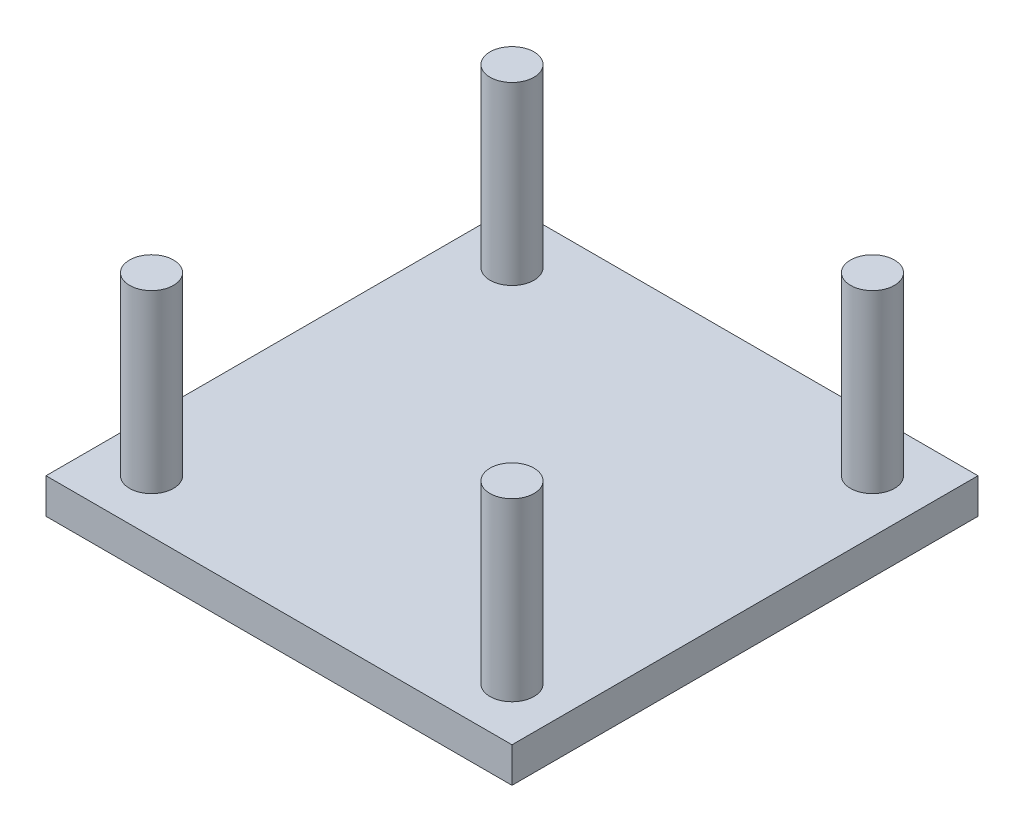
ISO-10303-21;
HEADER;
FILE_DESCRIPTION(('STEP AP214'),'2;1');
FILE_NAME('part.step','',(''),(''),'','','');
FILE_SCHEMA(('AUTOMOTIVE_DESIGN { 1 0 10303 214 1 1 1 1 }'));
ENDSEC;
DATA;
#1=APPLICATION_CONTEXT('core data for automotive mechanical design processes');
#2=APPLICATION_PROTOCOL_DEFINITION('international standard','automotive_design',2000,#1);
#3=PRODUCT_CONTEXT('',#1,'mechanical');
#4=PRODUCT('Part','Part','',(#3));
#5=PRODUCT_RELATED_PRODUCT_CATEGORY('part','',(#4));
#6=PRODUCT_DEFINITION_FORMATION('','',#4);
#7=PRODUCT_DEFINITION_CONTEXT('part definition',#1,'design');
#8=PRODUCT_DEFINITION('design','',#6,#7);
#9=PRODUCT_DEFINITION_SHAPE('','',#8);
#10=(LENGTH_UNIT() NAMED_UNIT(*) SI_UNIT(.MILLI.,.METRE.));
#11=(NAMED_UNIT(*) PLANE_ANGLE_UNIT() SI_UNIT($,.RADIAN.));
#12=(NAMED_UNIT(*) SI_UNIT($,.STERADIAN.) SOLID_ANGLE_UNIT());
#13=UNCERTAINTY_MEASURE_WITH_UNIT(LENGTH_MEASURE(1.E-05),#10,'distance_accuracy_value','');
#14=(GEOMETRIC_REPRESENTATION_CONTEXT(3) GLOBAL_UNCERTAINTY_ASSIGNED_CONTEXT((#13)) GLOBAL_UNIT_ASSIGNED_CONTEXT((#10,
#11,#12)) REPRESENTATION_CONTEXT('',''));
#15=CARTESIAN_POINT('',(0.,0.,0.));
#16=DIRECTION('',(0.,0.,1.));
#17=DIRECTION('',(1.,0.,0.));
#18=AXIS2_PLACEMENT_3D('',#15,#16,#17);
#19=CARTESIAN_POINT('',(-10.25,10.,10.25));
#20=DIRECTION('',(0.,-1.,0.));
#21=DIRECTION('',(0.,0.,-1.));
#22=AXIS2_PLACEMENT_3D('',#19,#20,#21);
#23=CYLINDRICAL_SURFACE('',#22,1.25);
#24=CARTESIAN_POINT('',(-10.25,10.,10.25));
#25=DIRECTION('',(0.,1.,0.));
#26=DIRECTION('',(0.,0.,1.));
#27=AXIS2_PLACEMENT_3D('',#24,#25,#26);
#28=CIRCLE('',#27,1.25);
#29=CARTESIAN_POINT('',(-10.25,10.,11.5));
#30=VERTEX_POINT('',#29);
#31=EDGE_CURVE('E111',#30,#30,#28,.T.);
#32=ORIENTED_EDGE('',*,*,#31,.F.);
#33=EDGE_LOOP('',(#32));
#34=FACE_BOUND('',#33,.T.);
#35=CARTESIAN_POINT('',(-10.25,0.,10.25));
#36=DIRECTION('',(0.,1.,0.));
#37=DIRECTION('',(0.,0.,1.));
#38=AXIS2_PLACEMENT_3D('',#35,#36,#37);
#39=CIRCLE('',#38,1.25);
#40=CARTESIAN_POINT('',(-10.25,0.,11.5));
#41=VERTEX_POINT('',#40);
#42=EDGE_CURVE('E110',#41,#41,#39,.T.);
#43=ORIENTED_EDGE('',*,*,#42,.T.);
#44=EDGE_LOOP('',(#43));
#45=FACE_BOUND('',#44,.T.);
#46=ADVANCED_FACE('F33',(#34,#45),#23,.T.);
#47=CARTESIAN_POINT('',(-10.25,10.,10.25));
#48=DIRECTION('',(0.,1.,0.));
#49=DIRECTION('',(0.,0.,1.));
#50=AXIS2_PLACEMENT_3D('',#47,#48,#49);
#51=PLANE('',#50);
#52=ORIENTED_EDGE('',*,*,#31,.T.);
#53=EDGE_LOOP('',(#52));
#54=FACE_BOUND('',#53,.T.);
#55=ADVANCED_FACE('F147',(#54),#51,.T.);
#56=CARTESIAN_POINT('',(13.25,-2.,13.25));
#57=DIRECTION('',(-1.,0.,0.));
#58=DIRECTION('',(0.,0.,1.));
#59=AXIS2_PLACEMENT_3D('',#56,#57,#58);
#60=PLANE('',#59);
#61=DIRECTION('',(0.,0.,1.));
#62=VECTOR('',#61,1.);
#63=CARTESIAN_POINT('',(13.25,0.,13.25));
#64=LINE('',#63,#62);
#65=CARTESIAN_POINT('',(13.25,0.,-13.25));
#66=VERTEX_POINT('',#65);
#67=CARTESIAN_POINT('',(13.25,0.,13.25));
#68=VERTEX_POINT('',#67);
#69=EDGE_CURVE('E100',#66,#68,#64,.T.);
#70=ORIENTED_EDGE('',*,*,#69,.T.);
#71=DIRECTION('',(0.,1.,0.));
#72=VECTOR('',#71,1.);
#73=CARTESIAN_POINT('',(13.25,-2.,13.25));
#74=LINE('',#73,#72);
#75=CARTESIAN_POINT('',(13.25,-2.,13.25));
#76=VERTEX_POINT('',#75);
#77=EDGE_CURVE('E91',#76,#68,#74,.T.);
#78=ORIENTED_EDGE('',*,*,#77,.F.);
#79=DIRECTION('',(0.,0.,1.));
#80=VECTOR('',#79,1.);
#81=CARTESIAN_POINT('',(13.25,-2.,13.25));
#82=LINE('',#81,#80);
#83=CARTESIAN_POINT('',(13.25,-2.,-13.25));
#84=VERTEX_POINT('',#83);
#85=EDGE_CURVE('E85',#84,#76,#82,.T.);
#86=ORIENTED_EDGE('',*,*,#85,.F.);
#87=DIRECTION('',(0.,1.,0.));
#88=VECTOR('',#87,1.);
#89=CARTESIAN_POINT('',(13.25,-2.,-13.25));
#90=LINE('',#89,#88);
#91=EDGE_CURVE('E96',#84,#66,#90,.T.);
#92=ORIENTED_EDGE('',*,*,#91,.T.);
#93=EDGE_LOOP('',(#70,#78,#86,#92));
#94=FACE_BOUND('',#93,.T.);
#95=ADVANCED_FACE('F135',(#94),#60,.F.);
#96=CARTESIAN_POINT('',(-13.25,-2.,13.25));
#97=DIRECTION('',(0.,0.,-1.));
#98=DIRECTION('',(-1.,0.,0.));
#99=AXIS2_PLACEMENT_3D('',#96,#97,#98);
#100=PLANE('',#99);
#101=DIRECTION('',(-1.,0.,0.));
#102=VECTOR('',#101,1.);
#103=CARTESIAN_POINT('',(-13.25,0.,13.25));
#104=LINE('',#103,#102);
#105=CARTESIAN_POINT('',(-13.25,0.,13.25));
#106=VERTEX_POINT('',#105);
#107=EDGE_CURVE('E90',#68,#106,#104,.T.);
#108=ORIENTED_EDGE('',*,*,#107,.T.);
#109=DIRECTION('',(0.,1.,0.));
#110=VECTOR('',#109,1.);
#111=CARTESIAN_POINT('',(-13.25,-2.,13.25));
#112=LINE('',#111,#110);
#113=CARTESIAN_POINT('',(-13.25,-2.,13.25));
#114=VERTEX_POINT('',#113);
#115=EDGE_CURVE('E88',#114,#106,#112,.T.);
#116=ORIENTED_EDGE('',*,*,#115,.F.);
#117=DIRECTION('',(-1.,0.,0.));
#118=VECTOR('',#117,1.);
#119=CARTESIAN_POINT('',(-13.25,-2.,13.25));
#120=LINE('',#119,#118);
#121=EDGE_CURVE('E80',#76,#114,#120,.T.);
#122=ORIENTED_EDGE('',*,*,#121,.F.);
#123=ORIENTED_EDGE('',*,*,#77,.T.);
#124=EDGE_LOOP('',(#108,#116,#122,#123));
#125=FACE_BOUND('',#124,.T.);
#126=ADVANCED_FACE('F89',(#125),#100,.F.);
#127=CARTESIAN_POINT('',(-13.25,-2.,13.25));
#128=DIRECTION('',(1.,0.,0.));
#129=DIRECTION('',(0.,0.,-1.));
#130=AXIS2_PLACEMENT_3D('',#127,#128,#129);
#131=PLANE('',#130);
#132=DIRECTION('',(0.,0.,-1.));
#133=VECTOR('',#132,1.);
#134=CARTESIAN_POINT('',(-13.25,0.,13.25));
#135=LINE('',#134,#133);
#136=CARTESIAN_POINT('',(-13.25,0.,-13.25));
#137=VERTEX_POINT('',#136);
#138=EDGE_CURVE('E66',#106,#137,#135,.T.);
#139=ORIENTED_EDGE('',*,*,#138,.T.);
#140=DIRECTION('',(0.,1.,0.));
#141=VECTOR('',#140,1.);
#142=CARTESIAN_POINT('',(-13.25,-2.,-13.25));
#143=LINE('',#142,#141);
#144=CARTESIAN_POINT('',(-13.25,-2.,-13.25));
#145=VERTEX_POINT('',#144);
#146=EDGE_CURVE('E92',#145,#137,#143,.T.);
#147=ORIENTED_EDGE('',*,*,#146,.F.);
#148=DIRECTION('',(0.,0.,-1.));
#149=VECTOR('',#148,1.);
#150=CARTESIAN_POINT('',(-13.25,-2.,13.25));
#151=LINE('',#150,#149);
#152=EDGE_CURVE('E83',#114,#145,#151,.T.);
#153=ORIENTED_EDGE('',*,*,#152,.F.);
#154=ORIENTED_EDGE('',*,*,#115,.T.);
#155=EDGE_LOOP('',(#139,#147,#153,#154));
#156=FACE_BOUND('',#155,.T.);
#157=ADVANCED_FACE('F94',(#156),#131,.F.);
#158=CARTESIAN_POINT('',(-13.25,-2.,-13.25));
#159=DIRECTION('',(0.,0.,1.));
#160=DIRECTION('',(1.,0.,0.));
#161=AXIS2_PLACEMENT_3D('',#158,#159,#160);
#162=PLANE('',#161);
#163=DIRECTION('',(1.,0.,0.));
#164=VECTOR('',#163,1.);
#165=CARTESIAN_POINT('',(-13.25,0.,-13.25));
#166=LINE('',#165,#164);
#167=EDGE_CURVE('E72',#137,#66,#166,.T.);
#168=ORIENTED_EDGE('',*,*,#167,.T.);
#169=ORIENTED_EDGE('',*,*,#91,.F.);
#170=DIRECTION('',(1.,0.,0.));
#171=VECTOR('',#170,1.);
#172=CARTESIAN_POINT('',(-13.25,-2.,-13.25));
#173=LINE('',#172,#171);
#174=EDGE_CURVE('E49',#145,#84,#173,.T.);
#175=ORIENTED_EDGE('',*,*,#174,.F.);
#176=ORIENTED_EDGE('',*,*,#146,.T.);
#177=EDGE_LOOP('',(#168,#169,#175,#176));
#178=FACE_BOUND('',#177,.T.);
#179=ADVANCED_FACE('F136',(#178),#162,.F.);
#180=CARTESIAN_POINT('',(0.,-2.,0.));
#181=DIRECTION('',(0.,-1.,0.));
#182=DIRECTION('',(0.,0.,-1.));
#183=AXIS2_PLACEMENT_3D('',#180,#181,#182);
#184=PLANE('',#183);
#185=CARTESIAN_POINT('',(-4.,-2.,-10.25));
#186=DIRECTION('',(0.,-1.,0.));
#187=DIRECTION('',(0.,0.,-1.));
#188=AXIS2_PLACEMENT_3D('',#185,#186,#187);
#189=CIRCLE('',#188,1.);
#190=CARTESIAN_POINT('',(-4.,-2.,-11.25));
#191=VERTEX_POINT('',#190);
#192=EDGE_CURVE('E293',#191,#191,#189,.T.);
#193=ORIENTED_EDGE('',*,*,#192,.F.);
#194=EDGE_LOOP('',(#193));
#195=FACE_BOUND('',#194,.T.);
#196=CARTESIAN_POINT('',(4.,-2.,-10.25));
#197=DIRECTION('',(0.,-1.,0.));
#198=DIRECTION('',(0.,0.,-1.));
#199=AXIS2_PLACEMENT_3D('',#196,#197,#198);
#200=CIRCLE('',#199,1.);
#201=CARTESIAN_POINT('',(4.,-2.,-11.25));
#202=VERTEX_POINT('',#201);
#203=EDGE_CURVE('E304',#202,#202,#200,.T.);
#204=ORIENTED_EDGE('',*,*,#203,.F.);
#205=EDGE_LOOP('',(#204));
#206=FACE_BOUND('',#205,.T.);
#207=ORIENTED_EDGE('',*,*,#85,.T.);
#208=ORIENTED_EDGE('',*,*,#121,.T.);
#209=ORIENTED_EDGE('',*,*,#152,.T.);
#210=ORIENTED_EDGE('',*,*,#174,.T.);
#211=EDGE_LOOP('',(#207,#208,#209,#210));
#212=FACE_BOUND('',#211,.T.);
#213=ADVANCED_FACE('F81',(#195,#206,#212),#184,.T.);
#214=CARTESIAN_POINT('',(0.,0.,0.));
#215=DIRECTION('',(0.,-1.,0.));
#216=DIRECTION('',(0.,0.,-1.));
#217=AXIS2_PLACEMENT_3D('',#214,#215,#216);
#218=PLANE('',#217);
#219=CARTESIAN_POINT('',(10.25,0.,10.25));
#220=DIRECTION('',(0.,-1.,0.));
#221=DIRECTION('',(0.,0.,-1.));
#222=AXIS2_PLACEMENT_3D('',#219,#220,#221);
#223=CIRCLE('',#222,1.25);
#224=CARTESIAN_POINT('',(10.25,0.,9.));
#225=VERTEX_POINT('',#224);
#226=EDGE_CURVE('E11',#225,#225,#223,.F.);
#227=ORIENTED_EDGE('',*,*,#226,.F.);
#228=EDGE_LOOP('',(#227));
#229=FACE_BOUND('',#228,.T.);
#230=CARTESIAN_POINT('',(10.25,0.,-10.25));
#231=DIRECTION('',(0.,-1.,0.));
#232=DIRECTION('',(0.,0.,-1.));
#233=AXIS2_PLACEMENT_3D('',#230,#231,#232);
#234=CIRCLE('',#233,1.25);
#235=CARTESIAN_POINT('',(10.25,0.,-11.5));
#236=VERTEX_POINT('',#235);
#237=EDGE_CURVE('E41',#236,#236,#234,.F.);
#238=ORIENTED_EDGE('',*,*,#237,.F.);
#239=EDGE_LOOP('',(#238));
#240=FACE_BOUND('',#239,.T.);
#241=CARTESIAN_POINT('',(-10.25,0.,-10.25));
#242=DIRECTION('',(0.,-1.,0.));
#243=DIRECTION('',(0.,0.,-1.));
#244=AXIS2_PLACEMENT_3D('',#241,#242,#243);
#245=CIRCLE('',#244,1.25);
#246=CARTESIAN_POINT('',(-10.25,0.,-11.5));
#247=VERTEX_POINT('',#246);
#248=EDGE_CURVE('E114',#247,#247,#245,.F.);
#249=ORIENTED_EDGE('',*,*,#248,.F.);
#250=EDGE_LOOP('',(#249));
#251=FACE_BOUND('',#250,.T.);
#252=ORIENTED_EDGE('',*,*,#42,.F.);
#253=EDGE_LOOP('',(#252));
#254=FACE_BOUND('',#253,.T.);
#255=ORIENTED_EDGE('',*,*,#69,.F.);
#256=ORIENTED_EDGE('',*,*,#167,.F.);
#257=ORIENTED_EDGE('',*,*,#138,.F.);
#258=ORIENTED_EDGE('',*,*,#107,.F.);
#259=EDGE_LOOP('',(#255,#256,#257,#258));
#260=FACE_BOUND('',#259,.T.);
#261=ADVANCED_FACE('F123',(#229,#240,#251,#254,#260),#218,.F.);
#262=CARTESIAN_POINT('',(-10.25,10.,-10.25));
#263=DIRECTION('',(0.,-1.,0.));
#264=DIRECTION('',(0.,0.,-1.));
#265=AXIS2_PLACEMENT_3D('',#262,#263,#264);
#266=CYLINDRICAL_SURFACE('',#265,1.25);
#267=CARTESIAN_POINT('',(-10.25,10.,-10.25));
#268=DIRECTION('',(0.,1.,0.));
#269=DIRECTION('',(0.,0.,1.));
#270=AXIS2_PLACEMENT_3D('',#267,#268,#269);
#271=CIRCLE('',#270,1.25);
#272=CARTESIAN_POINT('',(-10.25,10.,-9.));
#273=VERTEX_POINT('',#272);
#274=EDGE_CURVE('E103',#273,#273,#271,.T.);
#275=ORIENTED_EDGE('',*,*,#274,.F.);
#276=EDGE_LOOP('',(#275));
#277=FACE_BOUND('',#276,.T.);
#278=ORIENTED_EDGE('',*,*,#248,.T.);
#279=EDGE_LOOP('',(#278));
#280=FACE_BOUND('',#279,.T.);
#281=ADVANCED_FACE('F126',(#277,#280),#266,.T.);
#282=CARTESIAN_POINT('',(-10.25,10.,-10.25));
#283=DIRECTION('',(0.,1.,0.));
#284=DIRECTION('',(0.,0.,1.));
#285=AXIS2_PLACEMENT_3D('',#282,#283,#284);
#286=PLANE('',#285);
#287=ORIENTED_EDGE('',*,*,#274,.T.);
#288=EDGE_LOOP('',(#287));
#289=FACE_BOUND('',#288,.T.);
#290=ADVANCED_FACE('F190',(#289),#286,.T.);
#291=CARTESIAN_POINT('',(10.25,10.,-10.25));
#292=DIRECTION('',(0.,-1.,0.));
#293=DIRECTION('',(0.,0.,-1.));
#294=AXIS2_PLACEMENT_3D('',#291,#292,#293);
#295=CYLINDRICAL_SURFACE('',#294,1.25);
#296=CARTESIAN_POINT('',(10.25,10.,-10.25));
#297=DIRECTION('',(0.,1.,0.));
#298=DIRECTION('',(0.,0.,1.));
#299=AXIS2_PLACEMENT_3D('',#296,#297,#298);
#300=CIRCLE('',#299,1.25);
#301=CARTESIAN_POINT('',(10.25,10.,-9.));
#302=VERTEX_POINT('',#301);
#303=EDGE_CURVE('E296',#302,#302,#300,.T.);
#304=ORIENTED_EDGE('',*,*,#303,.F.);
#305=EDGE_LOOP('',(#304));
#306=FACE_BOUND('',#305,.T.);
#307=ORIENTED_EDGE('',*,*,#237,.T.);
#308=EDGE_LOOP('',(#307));
#309=FACE_BOUND('',#308,.T.);
#310=ADVANCED_FACE('F121',(#306,#309),#295,.T.);
#311=CARTESIAN_POINT('',(10.25,10.,-10.25));
#312=DIRECTION('',(0.,1.,0.));
#313=DIRECTION('',(0.,0.,1.));
#314=AXIS2_PLACEMENT_3D('',#311,#312,#313);
#315=PLANE('',#314);
#316=ORIENTED_EDGE('',*,*,#303,.T.);
#317=EDGE_LOOP('',(#316));
#318=FACE_BOUND('',#317,.T.);
#319=ADVANCED_FACE('F210',(#318),#315,.T.);
#320=CARTESIAN_POINT('',(10.25,10.,10.25));
#321=DIRECTION('',(0.,-1.,0.));
#322=DIRECTION('',(0.,0.,-1.));
#323=AXIS2_PLACEMENT_3D('',#320,#321,#322);
#324=CYLINDRICAL_SURFACE('',#323,1.25);
#325=CARTESIAN_POINT('',(10.25,10.,10.25));
#326=DIRECTION('',(0.,1.,0.));
#327=DIRECTION('',(0.,0.,1.));
#328=AXIS2_PLACEMENT_3D('',#325,#326,#327);
#329=CIRCLE('',#328,1.25);
#330=CARTESIAN_POINT('',(10.25,10.,11.5));
#331=VERTEX_POINT('',#330);
#332=EDGE_CURVE('E292',#331,#331,#329,.T.);
#333=ORIENTED_EDGE('',*,*,#332,.F.);
#334=EDGE_LOOP('',(#333));
#335=FACE_BOUND('',#334,.T.);
#336=ORIENTED_EDGE('',*,*,#226,.T.);
#337=EDGE_LOOP('',(#336));
#338=FACE_BOUND('',#337,.T.);
#339=ADVANCED_FACE('F220',(#335,#338),#324,.T.);
#340=CARTESIAN_POINT('',(10.25,10.,10.25));
#341=DIRECTION('',(0.,1.,0.));
#342=DIRECTION('',(0.,0.,1.));
#343=AXIS2_PLACEMENT_3D('',#340,#341,#342);
#344=PLANE('',#343);
#345=ORIENTED_EDGE('',*,*,#332,.T.);
#346=EDGE_LOOP('',(#345));
#347=FACE_BOUND('',#346,.T.);
#348=ADVANCED_FACE('F230',(#347),#344,.T.);
#349=CARTESIAN_POINT('',(4.,-0.5,-10.25));
#350=DIRECTION('',(0.,-1.,0.));
#351=DIRECTION('',(0.,0.,-1.));
#352=AXIS2_PLACEMENT_3D('',#349,#350,#351);
#353=CYLINDRICAL_SURFACE('',#352,1.);
#354=CARTESIAN_POINT('',(4.,-0.5,-10.25));
#355=DIRECTION('',(0.,-1.,0.));
#356=DIRECTION('',(0.,0.,-1.));
#357=AXIS2_PLACEMENT_3D('',#354,#355,#356);
#358=CIRCLE('',#357,1.);
#359=CARTESIAN_POINT('',(4.,-0.5,-11.25));
#360=VERTEX_POINT('',#359);
#361=EDGE_CURVE('E299',#360,#360,#358,.T.);
#362=ORIENTED_EDGE('',*,*,#361,.F.);
#363=EDGE_LOOP('',(#362));
#364=FACE_BOUND('',#363,.T.);
#365=ORIENTED_EDGE('',*,*,#203,.T.);
#366=EDGE_LOOP('',(#365));
#367=FACE_BOUND('',#366,.T.);
#368=ADVANCED_FACE('F240',(#364,#367),#353,.F.);
#369=CARTESIAN_POINT('',(4.,-0.5,-10.25));
#370=DIRECTION('',(0.,-1.,0.));
#371=DIRECTION('',(0.,0.,-1.));
#372=AXIS2_PLACEMENT_3D('',#369,#370,#371);
#373=PLANE('',#372);
#374=ORIENTED_EDGE('',*,*,#361,.T.);
#375=EDGE_LOOP('',(#374));
#376=FACE_BOUND('',#375,.T.);
#377=ADVANCED_FACE('F255',(#376),#373,.T.);
#378=CARTESIAN_POINT('',(-4.,-0.5,-10.25));
#379=DIRECTION('',(0.,-1.,0.));
#380=DIRECTION('',(0.,0.,-1.));
#381=AXIS2_PLACEMENT_3D('',#378,#379,#380);
#382=CYLINDRICAL_SURFACE('',#381,1.);
#383=CARTESIAN_POINT('',(-4.,-0.5,-10.25));
#384=DIRECTION('',(0.,-1.,0.));
#385=DIRECTION('',(0.,0.,-1.));
#386=AXIS2_PLACEMENT_3D('',#383,#384,#385);
#387=CIRCLE('',#386,1.);
#388=CARTESIAN_POINT('',(-4.,-0.5,-11.25));
#389=VERTEX_POINT('',#388);
#390=EDGE_CURVE('E291',#389,#389,#387,.T.);
#391=ORIENTED_EDGE('',*,*,#390,.F.);
#392=EDGE_LOOP('',(#391));
#393=FACE_BOUND('',#392,.T.);
#394=ORIENTED_EDGE('',*,*,#192,.T.);
#395=EDGE_LOOP('',(#394));
#396=FACE_BOUND('',#395,.T.);
#397=ADVANCED_FACE('F265',(#393,#396),#382,.F.);
#398=CARTESIAN_POINT('',(-4.,-0.5,-10.25));
#399=DIRECTION('',(0.,-1.,0.));
#400=DIRECTION('',(0.,0.,-1.));
#401=AXIS2_PLACEMENT_3D('',#398,#399,#400);
#402=PLANE('',#401);
#403=ORIENTED_EDGE('',*,*,#390,.T.);
#404=EDGE_LOOP('',(#403));
#405=FACE_BOUND('',#404,.T.);
#406=ADVANCED_FACE('F275',(#405),#402,.T.);
#407=CLOSED_SHELL('',(#46,#55,#95,#126,#157,#179,#213,#261,#281,#290,#310,#319,#339,#348,#368,
#377,#397,#406));
#408=MANIFOLD_SOLID_BREP('B2',#407);
#409=ADVANCED_BREP_SHAPE_REPRESENTATION('',(#18,#408),#14);
#410=SHAPE_DEFINITION_REPRESENTATION(#9,#409);
ENDSEC;
END-ISO-10303-21;
